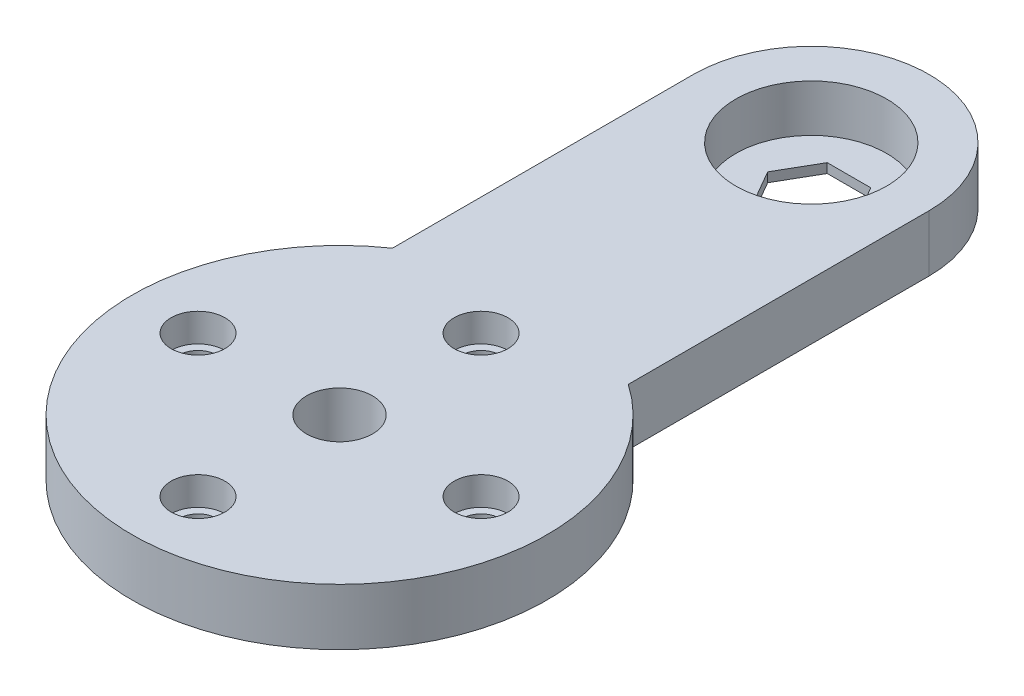
ISO-10303-21;
HEADER;
FILE_DESCRIPTION(('STEP AP214'),'2;1');
FILE_NAME('part.step','',(''),(''),'','','');
FILE_SCHEMA(('AUTOMOTIVE_DESIGN { 1 0 10303 214 1 1 1 1 }'));
ENDSEC;
DATA;
#1=APPLICATION_CONTEXT('core data for automotive mechanical design processes');
#2=APPLICATION_PROTOCOL_DEFINITION('international standard','automotive_design',2000,#1);
#3=PRODUCT_CONTEXT('',#1,'mechanical');
#4=PRODUCT('Part','Part','',(#3));
#5=PRODUCT_RELATED_PRODUCT_CATEGORY('part','',(#4));
#6=PRODUCT_DEFINITION_FORMATION('','',#4);
#7=PRODUCT_DEFINITION_CONTEXT('part definition',#1,'design');
#8=PRODUCT_DEFINITION('design','',#6,#7);
#9=PRODUCT_DEFINITION_SHAPE('','',#8);
#10=(LENGTH_UNIT() NAMED_UNIT(*) SI_UNIT(.MILLI.,.METRE.));
#11=(NAMED_UNIT(*) PLANE_ANGLE_UNIT() SI_UNIT($,.RADIAN.));
#12=(NAMED_UNIT(*) SI_UNIT($,.STERADIAN.) SOLID_ANGLE_UNIT());
#13=UNCERTAINTY_MEASURE_WITH_UNIT(LENGTH_MEASURE(1.E-05),#10,'distance_accuracy_value','');
#14=(GEOMETRIC_REPRESENTATION_CONTEXT(3) GLOBAL_UNCERTAINTY_ASSIGNED_CONTEXT((#13)) GLOBAL_UNIT_ASSIGNED_CONTEXT((#10,
#11,#12)) REPRESENTATION_CONTEXT('',''));
#15=CARTESIAN_POINT('',(0.,0.,0.));
#16=DIRECTION('',(0.,0.,1.));
#17=DIRECTION('',(1.,0.,0.));
#18=AXIS2_PLACEMENT_3D('',#15,#16,#17);
#19=CARTESIAN_POINT('',(0.,6.,50.));
#20=DIRECTION('',(0.,-1.,0.));
#21=DIRECTION('',(0.,0.,-1.));
#22=AXIS2_PLACEMENT_3D('',#19,#20,#21);
#23=CYLINDRICAL_SURFACE('',#22,22.);
#24=CARTESIAN_POINT('',(0.,0.,50.));
#25=DIRECTION('',(0.,1.,0.));
#26=DIRECTION('',(0.,0.,1.));
#27=AXIS2_PLACEMENT_3D('',#24,#25,#26);
#28=CIRCLE('',#27,22.);
#29=CARTESIAN_POINT('',(-12.5,0.,31.8961330097683));
#30=VERTEX_POINT('',#29);
#31=CARTESIAN_POINT('',(12.5,0.,31.8961330097683));
#32=VERTEX_POINT('',#31);
#33=EDGE_CURVE('E176',#30,#32,#28,.T.);
#34=ORIENTED_EDGE('',*,*,#33,.T.);
#35=DIRECTION('',(0.,-1.,0.));
#36=VECTOR('',#35,1.);
#37=CARTESIAN_POINT('',(12.5,6.,31.8961330097683));
#38=LINE('',#37,#36);
#39=CARTESIAN_POINT('',(12.5,6.,31.8961330097683));
#40=VERTEX_POINT('',#39);
#41=EDGE_CURVE('E225',#40,#32,#38,.T.);
#42=ORIENTED_EDGE('',*,*,#41,.F.);
#43=CARTESIAN_POINT('',(0.,6.,50.));
#44=DIRECTION('',(0.,1.,0.));
#45=DIRECTION('',(0.,0.,1.));
#46=AXIS2_PLACEMENT_3D('',#43,#44,#45);
#47=CIRCLE('',#46,22.);
#48=CARTESIAN_POINT('',(-12.5,6.,31.8961330097683));
#49=VERTEX_POINT('',#48);
#50=EDGE_CURVE('E199',#49,#40,#47,.T.);
#51=ORIENTED_EDGE('',*,*,#50,.F.);
#52=DIRECTION('',(0.,-1.,0.));
#53=VECTOR('',#52,1.);
#54=CARTESIAN_POINT('',(-12.5,6.,31.8961330097683));
#55=LINE('',#54,#53);
#56=EDGE_CURVE('E209',#49,#30,#55,.T.);
#57=ORIENTED_EDGE('',*,*,#56,.T.);
#58=EDGE_LOOP('',(#34,#42,#51,#57));
#59=FACE_BOUND('',#58,.T.);
#60=ADVANCED_FACE('F34',(#59),#23,.T.);
#61=CARTESIAN_POINT('',(12.5,6.,0.));
#62=DIRECTION('',(-1.,0.,0.));
#63=DIRECTION('',(0.,0.,1.));
#64=AXIS2_PLACEMENT_3D('',#61,#62,#63);
#65=PLANE('',#64);
#66=DIRECTION('',(0.,0.,-1.));
#67=VECTOR('',#66,1.);
#68=CARTESIAN_POINT('',(12.5,0.,0.));
#69=LINE('',#68,#67);
#70=CARTESIAN_POINT('',(12.5,0.,0.));
#71=VERTEX_POINT('',#70);
#72=EDGE_CURVE('E212',#32,#71,#69,.T.);
#73=ORIENTED_EDGE('',*,*,#72,.T.);
#74=DIRECTION('',(0.,-1.,0.));
#75=VECTOR('',#74,1.);
#76=CARTESIAN_POINT('',(12.5,6.,0.));
#77=LINE('',#76,#75);
#78=CARTESIAN_POINT('',(12.5,6.,0.));
#79=VERTEX_POINT('',#78);
#80=EDGE_CURVE('E222',#79,#71,#77,.T.);
#81=ORIENTED_EDGE('',*,*,#80,.F.);
#82=DIRECTION('',(0.,0.,-1.));
#83=VECTOR('',#82,1.);
#84=CARTESIAN_POINT('',(12.5,6.,0.));
#85=LINE('',#84,#83);
#86=EDGE_CURVE('E202',#40,#79,#85,.T.);
#87=ORIENTED_EDGE('',*,*,#86,.F.);
#88=ORIENTED_EDGE('',*,*,#41,.T.);
#89=EDGE_LOOP('',(#73,#81,#87,#88));
#90=FACE_BOUND('',#89,.T.);
#91=ADVANCED_FACE('F270',(#90),#65,.F.);
#92=CARTESIAN_POINT('',(0.,6.,0.));
#93=DIRECTION('',(0.,-1.,0.));
#94=DIRECTION('',(0.,0.,-1.));
#95=AXIS2_PLACEMENT_3D('',#92,#93,#94);
#96=CYLINDRICAL_SURFACE('',#95,12.5);
#97=CARTESIAN_POINT('',(0.,0.,0.));
#98=DIRECTION('',(0.,1.,0.));
#99=DIRECTION('',(0.,0.,1.));
#100=AXIS2_PLACEMENT_3D('',#97,#98,#99);
#101=CIRCLE('',#100,12.5);
#102=CARTESIAN_POINT('',(-12.5,0.,0.));
#103=VERTEX_POINT('',#102);
#104=EDGE_CURVE('E214',#71,#103,#101,.T.);
#105=ORIENTED_EDGE('',*,*,#104,.T.);
#106=DIRECTION('',(0.,-1.,0.));
#107=VECTOR('',#106,1.);
#108=CARTESIAN_POINT('',(-12.5,6.,0.));
#109=LINE('',#108,#107);
#110=CARTESIAN_POINT('',(-12.5,6.,0.));
#111=VERTEX_POINT('',#110);
#112=EDGE_CURVE('E219',#111,#103,#109,.T.);
#113=ORIENTED_EDGE('',*,*,#112,.F.);
#114=CARTESIAN_POINT('',(0.,6.,0.));
#115=DIRECTION('',(0.,1.,0.));
#116=DIRECTION('',(0.,0.,1.));
#117=AXIS2_PLACEMENT_3D('',#114,#115,#116);
#118=CIRCLE('',#117,12.5);
#119=EDGE_CURVE('E205',#79,#111,#118,.T.);
#120=ORIENTED_EDGE('',*,*,#119,.F.);
#121=ORIENTED_EDGE('',*,*,#80,.T.);
#122=EDGE_LOOP('',(#105,#113,#120,#121));
#123=FACE_BOUND('',#122,.T.);
#124=ADVANCED_FACE('F275',(#123),#96,.T.);
#125=CARTESIAN_POINT('',(-12.5,6.,0.));
#126=DIRECTION('',(1.,0.,0.));
#127=DIRECTION('',(0.,0.,-1.));
#128=AXIS2_PLACEMENT_3D('',#125,#126,#127);
#129=PLANE('',#128);
#130=DIRECTION('',(0.,0.,1.));
#131=VECTOR('',#130,1.);
#132=CARTESIAN_POINT('',(-12.5,0.,0.));
#133=LINE('',#132,#131);
#134=EDGE_CURVE('E203',#103,#30,#133,.T.);
#135=ORIENTED_EDGE('',*,*,#134,.T.);
#136=ORIENTED_EDGE('',*,*,#56,.F.);
#137=DIRECTION('',(0.,0.,1.));
#138=VECTOR('',#137,1.);
#139=CARTESIAN_POINT('',(-12.5,6.,0.));
#140=LINE('',#139,#138);
#141=EDGE_CURVE('E207',#111,#49,#140,.T.);
#142=ORIENTED_EDGE('',*,*,#141,.F.);
#143=ORIENTED_EDGE('',*,*,#112,.T.);
#144=EDGE_LOOP('',(#135,#136,#142,#143));
#145=FACE_BOUND('',#144,.T.);
#146=ADVANCED_FACE('F291',(#145),#129,.F.);
#147=CARTESIAN_POINT('',(0.,6.,50.));
#148=DIRECTION('',(0.,1.,0.));
#149=DIRECTION('',(0.,0.,1.));
#150=AXIS2_PLACEMENT_3D('',#147,#148,#149);
#151=PLANE('',#150);
#152=CARTESIAN_POINT('',(0.,6.,0.));
#153=DIRECTION('',(0.,1.,0.));
#154=DIRECTION('',(0.,0.,1.));
#155=AXIS2_PLACEMENT_3D('',#152,#153,#154);
#156=CIRCLE('',#155,8.);
#157=CARTESIAN_POINT('',(0.,6.,8.));
#158=VERTEX_POINT('',#157);
#159=EDGE_CURVE('E142',#158,#158,#156,.T.);
#160=ORIENTED_EDGE('',*,*,#159,.F.);
#161=EDGE_LOOP('',(#160));
#162=FACE_BOUND('',#161,.T.);
#163=CARTESIAN_POINT('',(0.,6.,49.9999999999998));
#164=DIRECTION('',(0.,1.,0.));
#165=DIRECTION('',(0.,0.,1.));
#166=AXIS2_PLACEMENT_3D('',#163,#164,#165);
#167=CIRCLE('',#166,3.5);
#168=CARTESIAN_POINT('',(0.,6.,53.4999999999998));
#169=VERTEX_POINT('',#168);
#170=EDGE_CURVE('E168',#169,#169,#167,.T.);
#171=ORIENTED_EDGE('',*,*,#170,.F.);
#172=EDGE_LOOP('',(#171));
#173=FACE_BOUND('',#172,.T.);
#174=CARTESIAN_POINT('',(0.,6.,35.));
#175=DIRECTION('',(0.,1.,0.));
#176=DIRECTION('',(0.,0.,1.));
#177=AXIS2_PLACEMENT_3D('',#174,#175,#176);
#178=CIRCLE('',#177,2.85);
#179=CARTESIAN_POINT('',(0.,6.,37.85));
#180=VERTEX_POINT('',#179);
#181=EDGE_CURVE('E177',#180,#180,#178,.T.);
#182=ORIENTED_EDGE('',*,*,#181,.F.);
#183=EDGE_LOOP('',(#182));
#184=FACE_BOUND('',#183,.T.);
#185=CARTESIAN_POINT('',(15.,6.,50.));
#186=DIRECTION('',(0.,1.,0.));
#187=DIRECTION('',(0.,0.,1.));
#188=AXIS2_PLACEMENT_3D('',#185,#186,#187);
#189=CIRCLE('',#188,2.85);
#190=CARTESIAN_POINT('',(15.,6.,52.8500000000001));
#191=VERTEX_POINT('',#190);
#192=EDGE_CURVE('E183',#191,#191,#189,.T.);
#193=ORIENTED_EDGE('',*,*,#192,.F.);
#194=EDGE_LOOP('',(#193));
#195=FACE_BOUND('',#194,.T.);
#196=CARTESIAN_POINT('',(0.,6.,65.));
#197=DIRECTION('',(0.,1.,0.));
#198=DIRECTION('',(0.,0.,1.));
#199=AXIS2_PLACEMENT_3D('',#196,#197,#198);
#200=CIRCLE('',#199,2.85);
#201=CARTESIAN_POINT('',(0.,6.,67.85));
#202=VERTEX_POINT('',#201);
#203=EDGE_CURVE('E189',#202,#202,#200,.T.);
#204=ORIENTED_EDGE('',*,*,#203,.F.);
#205=EDGE_LOOP('',(#204));
#206=FACE_BOUND('',#205,.T.);
#207=CARTESIAN_POINT('',(-15.,6.,49.9999999999998));
#208=DIRECTION('',(0.,1.,0.));
#209=DIRECTION('',(0.,0.,1.));
#210=AXIS2_PLACEMENT_3D('',#207,#208,#209);
#211=CIRCLE('',#210,2.85);
#212=CARTESIAN_POINT('',(-15.,6.,52.8499999999998));
#213=VERTEX_POINT('',#212);
#214=EDGE_CURVE('E195',#213,#213,#211,.T.);
#215=ORIENTED_EDGE('',*,*,#214,.F.);
#216=EDGE_LOOP('',(#215));
#217=FACE_BOUND('',#216,.T.);
#218=ORIENTED_EDGE('',*,*,#50,.T.);
#219=ORIENTED_EDGE('',*,*,#86,.T.);
#220=ORIENTED_EDGE('',*,*,#119,.T.);
#221=ORIENTED_EDGE('',*,*,#141,.T.);
#222=EDGE_LOOP('',(#218,#219,#220,#221));
#223=FACE_BOUND('',#222,.T.);
#224=ADVANCED_FACE('F287',(#162,#173,#184,#195,#206,#217,#223),#151,.T.);
#225=CARTESIAN_POINT('',(0.,0.,50.));
#226=DIRECTION('',(0.,1.,0.));
#227=DIRECTION('',(0.,0.,1.));
#228=AXIS2_PLACEMENT_3D('',#225,#226,#227);
#229=PLANE('',#228);
#230=DIRECTION('',(-0.5,0.,0.866025403784439));
#231=VECTOR('',#230,1.);
#232=CARTESIAN_POINT('',(4.618802153517,0.,0.));
#233=LINE('',#232,#231);
#234=CARTESIAN_POINT('',(4.61880215351701,0.,0.));
#235=VERTEX_POINT('',#234);
#236=CARTESIAN_POINT('',(2.3094010767585,0.,4.));
#237=VERTEX_POINT('',#236);
#238=EDGE_CURVE('E121',#235,#237,#233,.T.);
#239=ORIENTED_EDGE('',*,*,#238,.F.);
#240=DIRECTION('',(0.499999999999999,0.,0.866025403784439));
#241=VECTOR('',#240,1.);
#242=CARTESIAN_POINT('',(2.3094010767585,0.,-4.));
#243=LINE('',#242,#241);
#244=CARTESIAN_POINT('',(2.3094010767585,0.,-4.));
#245=VERTEX_POINT('',#244);
#246=EDGE_CURVE('E48',#245,#235,#243,.T.);
#247=ORIENTED_EDGE('',*,*,#246,.F.);
#248=DIRECTION('',(1.,0.,0.));
#249=VECTOR('',#248,1.);
#250=CARTESIAN_POINT('',(-2.3094010767585,0.,-4.));
#251=LINE('',#250,#249);
#252=CARTESIAN_POINT('',(-2.3094010767585,0.,-4.));
#253=VERTEX_POINT('',#252);
#254=EDGE_CURVE('E137',#253,#245,#251,.T.);
#255=ORIENTED_EDGE('',*,*,#254,.F.);
#256=DIRECTION('',(0.5,0.,-0.866025403784438));
#257=VECTOR('',#256,1.);
#258=CARTESIAN_POINT('',(-4.618802153517,0.,0.));
#259=LINE('',#258,#257);
#260=CARTESIAN_POINT('',(-4.618802153517,0.,0.));
#261=VERTEX_POINT('',#260);
#262=EDGE_CURVE('E131',#261,#253,#259,.T.);
#263=ORIENTED_EDGE('',*,*,#262,.F.);
#264=DIRECTION('',(-0.499999999999999,0.,-0.866025403784439));
#265=VECTOR('',#264,1.);
#266=CARTESIAN_POINT('',(-2.3094010767585,0.,4.));
#267=LINE('',#266,#265);
#268=CARTESIAN_POINT('',(-2.3094010767585,0.,4.));
#269=VERTEX_POINT('',#268);
#270=EDGE_CURVE('E129',#269,#261,#267,.T.);
#271=ORIENTED_EDGE('',*,*,#270,.F.);
#272=DIRECTION('',(-1.,0.,0.));
#273=VECTOR('',#272,1.);
#274=CARTESIAN_POINT('',(2.3094010767585,0.,4.));
#275=LINE('',#274,#273);
#276=EDGE_CURVE('E112',#237,#269,#275,.T.);
#277=ORIENTED_EDGE('',*,*,#276,.F.);
#278=EDGE_LOOP('',(#239,#247,#255,#263,#271,#277));
#279=FACE_BOUND('',#278,.T.);
#280=CARTESIAN_POINT('',(0.,0.,35.));
#281=DIRECTION('',(0.,1.,0.));
#282=DIRECTION('',(0.,0.,1.));
#283=AXIS2_PLACEMENT_3D('',#280,#281,#282);
#284=CIRCLE('',#283,2.);
#285=CARTESIAN_POINT('',(0.,0.,37.));
#286=VERTEX_POINT('',#285);
#287=EDGE_CURVE('E155',#286,#286,#284,.T.);
#288=ORIENTED_EDGE('',*,*,#287,.T.);
#289=EDGE_LOOP('',(#288));
#290=FACE_BOUND('',#289,.T.);
#291=CARTESIAN_POINT('',(-14.9999999999998,0.,49.9999999999999));
#292=DIRECTION('',(0.,1.,0.));
#293=DIRECTION('',(0.,0.,1.));
#294=AXIS2_PLACEMENT_3D('',#291,#292,#293);
#295=CIRCLE('',#294,2.00000000000001);
#296=CARTESIAN_POINT('',(-14.9999999999998,0.,51.9999999999999));
#297=VERTEX_POINT('',#296);
#298=EDGE_CURVE('E152',#297,#297,#295,.T.);
#299=ORIENTED_EDGE('',*,*,#298,.T.);
#300=EDGE_LOOP('',(#299));
#301=FACE_BOUND('',#300,.T.);
#302=CARTESIAN_POINT('',(0.,0.,64.9999999999997));
#303=DIRECTION('',(0.,1.,0.));
#304=DIRECTION('',(0.,0.,1.));
#305=AXIS2_PLACEMENT_3D('',#302,#303,#304);
#306=CIRCLE('',#305,2.);
#307=CARTESIAN_POINT('',(0.,0.,66.9999999999997));
#308=VERTEX_POINT('',#307);
#309=EDGE_CURVE('E160',#308,#308,#306,.T.);
#310=ORIENTED_EDGE('',*,*,#309,.T.);
#311=EDGE_LOOP('',(#310));
#312=FACE_BOUND('',#311,.T.);
#313=CARTESIAN_POINT('',(14.9999999999998,0.,49.9999999999998));
#314=DIRECTION('',(0.,1.,0.));
#315=DIRECTION('',(0.,0.,1.));
#316=AXIS2_PLACEMENT_3D('',#313,#314,#315);
#317=CIRCLE('',#316,2.);
#318=CARTESIAN_POINT('',(14.9999999999998,0.,51.9999999999998));
#319=VERTEX_POINT('',#318);
#320=EDGE_CURVE('E163',#319,#319,#317,.T.);
#321=ORIENTED_EDGE('',*,*,#320,.T.);
#322=EDGE_LOOP('',(#321));
#323=FACE_BOUND('',#322,.T.);
#324=CARTESIAN_POINT('',(0.,0.,49.9999999999998));
#325=DIRECTION('',(0.,1.,0.));
#326=DIRECTION('',(0.,0.,1.));
#327=AXIS2_PLACEMENT_3D('',#324,#325,#326);
#328=CIRCLE('',#327,3.5);
#329=CARTESIAN_POINT('',(0.,0.,53.4999999999998));
#330=VERTEX_POINT('',#329);
#331=EDGE_CURVE('E159',#330,#330,#328,.T.);
#332=ORIENTED_EDGE('',*,*,#331,.T.);
#333=EDGE_LOOP('',(#332));
#334=FACE_BOUND('',#333,.T.);
#335=ORIENTED_EDGE('',*,*,#33,.F.);
#336=ORIENTED_EDGE('',*,*,#134,.F.);
#337=ORIENTED_EDGE('',*,*,#104,.F.);
#338=ORIENTED_EDGE('',*,*,#72,.F.);
#339=EDGE_LOOP('',(#335,#336,#337,#338));
#340=FACE_BOUND('',#339,.T.);
#341=ADVANCED_FACE('F125',(#279,#290,#301,#312,#323,#334,#340),#229,.F.);
#342=CARTESIAN_POINT('',(-15.,3.,49.9999999999998));
#343=DIRECTION('',(0.,1.,0.));
#344=DIRECTION('',(0.,0.,1.));
#345=AXIS2_PLACEMENT_3D('',#342,#343,#344);
#346=CYLINDRICAL_SURFACE('',#345,2.85);
#347=CARTESIAN_POINT('',(-15.,3.,49.9999999999998));
#348=DIRECTION('',(0.,1.,0.));
#349=DIRECTION('',(0.,0.,1.));
#350=AXIS2_PLACEMENT_3D('',#347,#348,#349);
#351=CIRCLE('',#350,2.85);
#352=CARTESIAN_POINT('',(-15.,3.,52.8499999999998));
#353=VERTEX_POINT('',#352);
#354=EDGE_CURVE('E192',#353,#353,#351,.T.);
#355=ORIENTED_EDGE('',*,*,#354,.F.);
#356=EDGE_LOOP('',(#355));
#357=FACE_BOUND('',#356,.T.);
#358=ORIENTED_EDGE('',*,*,#214,.T.);
#359=EDGE_LOOP('',(#358));
#360=FACE_BOUND('',#359,.T.);
#361=ADVANCED_FACE('F302',(#357,#360),#346,.F.);
#362=CARTESIAN_POINT('',(-15.,3.,49.9999999999998));
#363=DIRECTION('',(0.,1.,0.));
#364=DIRECTION('',(0.,0.,1.));
#365=AXIS2_PLACEMENT_3D('',#362,#363,#364);
#366=PLANE('',#365);
#367=CARTESIAN_POINT('',(-14.9999999999998,3.,49.9999999999999));
#368=DIRECTION('',(0.,1.,0.));
#369=DIRECTION('',(0.,0.,1.));
#370=AXIS2_PLACEMENT_3D('',#367,#368,#369);
#371=CIRCLE('',#370,2.00000000000001);
#372=CARTESIAN_POINT('',(-14.9999999999998,3.,51.9999999999999));
#373=VERTEX_POINT('',#372);
#374=EDGE_CURVE('E198',#373,#373,#371,.T.);
#375=ORIENTED_EDGE('',*,*,#374,.F.);
#376=EDGE_LOOP('',(#375));
#377=FACE_BOUND('',#376,.T.);
#378=ORIENTED_EDGE('',*,*,#354,.T.);
#379=EDGE_LOOP('',(#378));
#380=FACE_BOUND('',#379,.T.);
#381=ADVANCED_FACE('F308',(#377,#380),#366,.T.);
#382=CARTESIAN_POINT('',(0.,3.,65.));
#383=DIRECTION('',(0.,1.,0.));
#384=DIRECTION('',(0.,0.,1.));
#385=AXIS2_PLACEMENT_3D('',#382,#383,#384);
#386=CYLINDRICAL_SURFACE('',#385,2.85);
#387=CARTESIAN_POINT('',(0.,3.,65.));
#388=DIRECTION('',(0.,1.,0.));
#389=DIRECTION('',(0.,0.,1.));
#390=AXIS2_PLACEMENT_3D('',#387,#388,#389);
#391=CIRCLE('',#390,2.85);
#392=CARTESIAN_POINT('',(0.,3.,67.85));
#393=VERTEX_POINT('',#392);
#394=EDGE_CURVE('E186',#393,#393,#391,.T.);
#395=ORIENTED_EDGE('',*,*,#394,.F.);
#396=EDGE_LOOP('',(#395));
#397=FACE_BOUND('',#396,.T.);
#398=ORIENTED_EDGE('',*,*,#203,.T.);
#399=EDGE_LOOP('',(#398));
#400=FACE_BOUND('',#399,.T.);
#401=ADVANCED_FACE('F312',(#397,#400),#386,.F.);
#402=CARTESIAN_POINT('',(0.,3.,65.));
#403=DIRECTION('',(0.,1.,0.));
#404=DIRECTION('',(0.,0.,1.));
#405=AXIS2_PLACEMENT_3D('',#402,#403,#404);
#406=PLANE('',#405);
#407=CARTESIAN_POINT('',(0.,3.,64.9999999999997));
#408=DIRECTION('',(0.,1.,0.));
#409=DIRECTION('',(0.,0.,1.));
#410=AXIS2_PLACEMENT_3D('',#407,#408,#409);
#411=CIRCLE('',#410,2.);
#412=CARTESIAN_POINT('',(0.,3.,66.9999999999997));
#413=VERTEX_POINT('',#412);
#414=EDGE_CURVE('E234',#413,#413,#411,.T.);
#415=ORIENTED_EDGE('',*,*,#414,.F.);
#416=EDGE_LOOP('',(#415));
#417=FACE_BOUND('',#416,.T.);
#418=ORIENTED_EDGE('',*,*,#394,.T.);
#419=EDGE_LOOP('',(#418));
#420=FACE_BOUND('',#419,.T.);
#421=ADVANCED_FACE('F316',(#417,#420),#406,.T.);
#422=CARTESIAN_POINT('',(15.,3.,50.));
#423=DIRECTION('',(0.,1.,0.));
#424=DIRECTION('',(0.,0.,1.));
#425=AXIS2_PLACEMENT_3D('',#422,#423,#424);
#426=CYLINDRICAL_SURFACE('',#425,2.85);
#427=CARTESIAN_POINT('',(15.,3.,50.));
#428=DIRECTION('',(0.,1.,0.));
#429=DIRECTION('',(0.,0.,1.));
#430=AXIS2_PLACEMENT_3D('',#427,#428,#429);
#431=CIRCLE('',#430,2.85);
#432=CARTESIAN_POINT('',(15.,3.,52.8500000000001));
#433=VERTEX_POINT('',#432);
#434=EDGE_CURVE('E180',#433,#433,#431,.T.);
#435=ORIENTED_EDGE('',*,*,#434,.F.);
#436=EDGE_LOOP('',(#435));
#437=FACE_BOUND('',#436,.T.);
#438=ORIENTED_EDGE('',*,*,#192,.T.);
#439=EDGE_LOOP('',(#438));
#440=FACE_BOUND('',#439,.T.);
#441=ADVANCED_FACE('F320',(#437,#440),#426,.F.);
#442=CARTESIAN_POINT('',(15.,3.,50.));
#443=DIRECTION('',(0.,1.,0.));
#444=DIRECTION('',(0.,0.,1.));
#445=AXIS2_PLACEMENT_3D('',#442,#443,#444);
#446=PLANE('',#445);
#447=CARTESIAN_POINT('',(14.9999999999998,3.,49.9999999999998));
#448=DIRECTION('',(0.,1.,0.));
#449=DIRECTION('',(0.,0.,1.));
#450=AXIS2_PLACEMENT_3D('',#447,#448,#449);
#451=CIRCLE('',#450,2.);
#452=CARTESIAN_POINT('',(14.9999999999998,3.,51.9999999999998));
#453=VERTEX_POINT('',#452);
#454=EDGE_CURVE('E231',#453,#453,#451,.T.);
#455=ORIENTED_EDGE('',*,*,#454,.F.);
#456=EDGE_LOOP('',(#455));
#457=FACE_BOUND('',#456,.T.);
#458=ORIENTED_EDGE('',*,*,#434,.T.);
#459=EDGE_LOOP('',(#458));
#460=FACE_BOUND('',#459,.T.);
#461=ADVANCED_FACE('F324',(#457,#460),#446,.T.);
#462=CARTESIAN_POINT('',(0.,3.,35.));
#463=DIRECTION('',(0.,1.,0.));
#464=DIRECTION('',(0.,0.,1.));
#465=AXIS2_PLACEMENT_3D('',#462,#463,#464);
#466=CYLINDRICAL_SURFACE('',#465,2.85);
#467=CARTESIAN_POINT('',(0.,3.,35.));
#468=DIRECTION('',(0.,1.,0.));
#469=DIRECTION('',(0.,0.,1.));
#470=AXIS2_PLACEMENT_3D('',#467,#468,#469);
#471=CIRCLE('',#470,2.85);
#472=CARTESIAN_POINT('',(0.,3.,37.85));
#473=VERTEX_POINT('',#472);
#474=EDGE_CURVE('E173',#473,#473,#471,.T.);
#475=ORIENTED_EDGE('',*,*,#474,.F.);
#476=EDGE_LOOP('',(#475));
#477=FACE_BOUND('',#476,.T.);
#478=ORIENTED_EDGE('',*,*,#181,.T.);
#479=EDGE_LOOP('',(#478));
#480=FACE_BOUND('',#479,.T.);
#481=ADVANCED_FACE('F328',(#477,#480),#466,.F.);
#482=CARTESIAN_POINT('',(0.,3.,35.));
#483=DIRECTION('',(0.,1.,0.));
#484=DIRECTION('',(0.,0.,1.));
#485=AXIS2_PLACEMENT_3D('',#482,#483,#484);
#486=PLANE('',#485);
#487=CARTESIAN_POINT('',(0.,3.,35.));
#488=DIRECTION('',(0.,1.,0.));
#489=DIRECTION('',(0.,0.,1.));
#490=AXIS2_PLACEMENT_3D('',#487,#488,#489);
#491=CIRCLE('',#490,2.);
#492=CARTESIAN_POINT('',(0.,3.,37.));
#493=VERTEX_POINT('',#492);
#494=EDGE_CURVE('E158',#493,#493,#491,.T.);
#495=ORIENTED_EDGE('',*,*,#494,.F.);
#496=EDGE_LOOP('',(#495));
#497=FACE_BOUND('',#496,.T.);
#498=ORIENTED_EDGE('',*,*,#474,.T.);
#499=EDGE_LOOP('',(#498));
#500=FACE_BOUND('',#499,.T.);
#501=ADVANCED_FACE('F332',(#497,#500),#486,.T.);
#502=CARTESIAN_POINT('',(0.,0.,35.));
#503=DIRECTION('',(0.,1.,0.));
#504=DIRECTION('',(0.,0.,1.));
#505=AXIS2_PLACEMENT_3D('',#502,#503,#504);
#506=CYLINDRICAL_SURFACE('',#505,2.);
#507=ORIENTED_EDGE('',*,*,#494,.T.);
#508=EDGE_LOOP('',(#507));
#509=FACE_BOUND('',#508,.T.);
#510=ORIENTED_EDGE('',*,*,#287,.F.);
#511=EDGE_LOOP('',(#510));
#512=FACE_BOUND('',#511,.T.);
#513=ADVANCED_FACE('F336',(#509,#512),#506,.F.);
#514=CARTESIAN_POINT('',(14.9999999999998,0.,49.9999999999998));
#515=DIRECTION('',(0.,1.,0.));
#516=DIRECTION('',(0.,0.,1.));
#517=AXIS2_PLACEMENT_3D('',#514,#515,#516);
#518=CYLINDRICAL_SURFACE('',#517,2.);
#519=ORIENTED_EDGE('',*,*,#454,.T.);
#520=EDGE_LOOP('',(#519));
#521=FACE_BOUND('',#520,.T.);
#522=ORIENTED_EDGE('',*,*,#320,.F.);
#523=EDGE_LOOP('',(#522));
#524=FACE_BOUND('',#523,.T.);
#525=ADVANCED_FACE('F338',(#521,#524),#518,.F.);
#526=CARTESIAN_POINT('',(0.,0.,64.9999999999997));
#527=DIRECTION('',(0.,1.,0.));
#528=DIRECTION('',(0.,0.,1.));
#529=AXIS2_PLACEMENT_3D('',#526,#527,#528);
#530=CYLINDRICAL_SURFACE('',#529,2.);
#531=ORIENTED_EDGE('',*,*,#414,.T.);
#532=EDGE_LOOP('',(#531));
#533=FACE_BOUND('',#532,.T.);
#534=ORIENTED_EDGE('',*,*,#309,.F.);
#535=EDGE_LOOP('',(#534));
#536=FACE_BOUND('',#535,.T.);
#537=ADVANCED_FACE('F341',(#533,#536),#530,.F.);
#538=CARTESIAN_POINT('',(-14.9999999999998,0.,49.9999999999999));
#539=DIRECTION('',(0.,1.,0.));
#540=DIRECTION('',(0.,0.,1.));
#541=AXIS2_PLACEMENT_3D('',#538,#539,#540);
#542=CYLINDRICAL_SURFACE('',#541,2.00000000000001);
#543=ORIENTED_EDGE('',*,*,#374,.T.);
#544=EDGE_LOOP('',(#543));
#545=FACE_BOUND('',#544,.T.);
#546=ORIENTED_EDGE('',*,*,#298,.F.);
#547=EDGE_LOOP('',(#546));
#548=FACE_BOUND('',#547,.T.);
#549=ADVANCED_FACE('F347',(#545,#548),#542,.F.);
#550=CARTESIAN_POINT('',(0.,0.,49.9999999999998));
#551=DIRECTION('',(0.,1.,0.));
#552=DIRECTION('',(0.,0.,1.));
#553=AXIS2_PLACEMENT_3D('',#550,#551,#552);
#554=CYLINDRICAL_SURFACE('',#553,3.5);
#555=ORIENTED_EDGE('',*,*,#331,.F.);
#556=EDGE_LOOP('',(#555));
#557=FACE_BOUND('',#556,.T.);
#558=ORIENTED_EDGE('',*,*,#170,.T.);
#559=EDGE_LOOP('',(#558));
#560=FACE_BOUND('',#559,.T.);
#561=ADVANCED_FACE('F343',(#557,#560),#554,.F.);
#562=CARTESIAN_POINT('',(0.,1.,0.));
#563=DIRECTION('',(0.,1.,0.));
#564=DIRECTION('',(0.,0.,1.));
#565=AXIS2_PLACEMENT_3D('',#562,#563,#564);
#566=CYLINDRICAL_SURFACE('',#565,8.);
#567=CARTESIAN_POINT('',(0.,1.,0.));
#568=DIRECTION('',(0.,1.,0.));
#569=DIRECTION('',(0.,0.,1.));
#570=AXIS2_PLACEMENT_3D('',#567,#568,#569);
#571=CIRCLE('',#570,8.);
#572=CARTESIAN_POINT('',(0.,1.,8.));
#573=VERTEX_POINT('',#572);
#574=EDGE_CURVE('E149',#573,#573,#571,.T.);
#575=ORIENTED_EDGE('',*,*,#574,.F.);
#576=EDGE_LOOP('',(#575));
#577=FACE_BOUND('',#576,.T.);
#578=ORIENTED_EDGE('',*,*,#159,.T.);
#579=EDGE_LOOP('',(#578));
#580=FACE_BOUND('',#579,.T.);
#581=ADVANCED_FACE('F346',(#577,#580),#566,.F.);
#582=CARTESIAN_POINT('',(0.,1.,0.));
#583=DIRECTION('',(0.,1.,0.));
#584=DIRECTION('',(0.,0.,1.));
#585=AXIS2_PLACEMENT_3D('',#582,#583,#584);
#586=PLANE('',#585);
#587=DIRECTION('',(-0.499999999999999,0.,-0.866025403784439));
#588=VECTOR('',#587,1.);
#589=CARTESIAN_POINT('',(3.46410161513775,1.,-2.));
#590=LINE('',#589,#588);
#591=CARTESIAN_POINT('',(4.618802153517,1.,0.));
#592=VERTEX_POINT('',#591);
#593=CARTESIAN_POINT('',(2.3094010767585,1.,-4.));
#594=VERTEX_POINT('',#593);
#595=EDGE_CURVE('E11',#592,#594,#590,.T.);
#596=ORIENTED_EDGE('',*,*,#595,.F.);
#597=DIRECTION('',(0.5,0.,-0.866025403784439));
#598=VECTOR('',#597,1.);
#599=CARTESIAN_POINT('',(3.46410161513775,1.,2.));
#600=LINE('',#599,#598);
#601=CARTESIAN_POINT('',(2.3094010767585,1.,4.));
#602=VERTEX_POINT('',#601);
#603=EDGE_CURVE('E228',#602,#592,#600,.T.);
#604=ORIENTED_EDGE('',*,*,#603,.F.);
#605=DIRECTION('',(1.,0.,0.));
#606=VECTOR('',#605,1.);
#607=CARTESIAN_POINT('',(0.,1.,4.));
#608=LINE('',#607,#606);
#609=CARTESIAN_POINT('',(-2.3094010767585,1.,4.));
#610=VERTEX_POINT('',#609);
#611=EDGE_CURVE('E115',#610,#602,#608,.T.);
#612=ORIENTED_EDGE('',*,*,#611,.F.);
#613=DIRECTION('',(0.499999999999999,0.,0.866025403784439));
#614=VECTOR('',#613,1.);
#615=CARTESIAN_POINT('',(-3.46410161513775,1.,2.));
#616=LINE('',#615,#614);
#617=CARTESIAN_POINT('',(-4.618802153517,1.,0.));
#618=VERTEX_POINT('',#617);
#619=EDGE_CURVE('E241',#618,#610,#616,.T.);
#620=ORIENTED_EDGE('',*,*,#619,.F.);
#621=DIRECTION('',(-0.500000000000001,0.,0.866025403784438));
#622=VECTOR('',#621,1.);
#623=CARTESIAN_POINT('',(-3.46410161513775,1.,-2.));
#624=LINE('',#623,#622);
#625=CARTESIAN_POINT('',(-2.3094010767585,1.,-4.));
#626=VERTEX_POINT('',#625);
#627=EDGE_CURVE('E243',#626,#618,#624,.T.);
#628=ORIENTED_EDGE('',*,*,#627,.F.);
#629=DIRECTION('',(-1.,0.,0.));
#630=VECTOR('',#629,1.);
#631=CARTESIAN_POINT('',(0.,1.,-4.));
#632=LINE('',#631,#630);
#633=EDGE_CURVE('E41',#594,#626,#632,.T.);
#634=ORIENTED_EDGE('',*,*,#633,.F.);
#635=EDGE_LOOP('',(#596,#604,#612,#620,#628,#634));
#636=FACE_BOUND('',#635,.T.);
#637=ORIENTED_EDGE('',*,*,#574,.T.);
#638=EDGE_LOOP('',(#637));
#639=FACE_BOUND('',#638,.T.);
#640=ADVANCED_FACE('F257',(#636,#639),#586,.T.);
#641=CARTESIAN_POINT('',(2.3094010767585,3.,-4.));
#642=DIRECTION('',(0.866025403784439,0.,-0.499999999999999));
#643=DIRECTION('',(-0.499999999999999,0.,-0.866025403784439));
#644=AXIS2_PLACEMENT_3D('',#641,#642,#643);
#645=PLANE('',#644);
#646=ORIENTED_EDGE('',*,*,#595,.T.);
#647=DIRECTION('',(0.,-1.,0.));
#648=VECTOR('',#647,1.);
#649=CARTESIAN_POINT('',(2.3094010767585,3.,-4.));
#650=LINE('',#649,#648);
#651=EDGE_CURVE('E140',#594,#245,#650,.T.);
#652=ORIENTED_EDGE('',*,*,#651,.T.);
#653=ORIENTED_EDGE('',*,*,#246,.T.);
#654=DIRECTION('',(0.,-1.,0.));
#655=VECTOR('',#654,1.);
#656=CARTESIAN_POINT('',(4.618802153517,3.,0.));
#657=LINE('',#656,#655);
#658=EDGE_CURVE('E118',#592,#235,#657,.T.);
#659=ORIENTED_EDGE('',*,*,#658,.F.);
#660=EDGE_LOOP('',(#646,#652,#653,#659));
#661=FACE_BOUND('',#660,.T.);
#662=ADVANCED_FACE('F363',(#661),#645,.F.);
#663=CARTESIAN_POINT('',(-2.3094010767585,3.,-4.));
#664=DIRECTION('',(0.,0.,-1.));
#665=DIRECTION('',(-1.,0.,0.));
#666=AXIS2_PLACEMENT_3D('',#663,#664,#665);
#667=PLANE('',#666);
#668=ORIENTED_EDGE('',*,*,#633,.T.);
#669=DIRECTION('',(0.,-1.,0.));
#670=VECTOR('',#669,1.);
#671=CARTESIAN_POINT('',(-2.3094010767585,3.,-4.));
#672=LINE('',#671,#670);
#673=EDGE_CURVE('E143',#626,#253,#672,.T.);
#674=ORIENTED_EDGE('',*,*,#673,.T.);
#675=ORIENTED_EDGE('',*,*,#254,.T.);
#676=ORIENTED_EDGE('',*,*,#651,.F.);
#677=EDGE_LOOP('',(#668,#674,#675,#676));
#678=FACE_BOUND('',#677,.T.);
#679=ADVANCED_FACE('F248',(#678),#667,.F.);
#680=CARTESIAN_POINT('',(-4.618802153517,3.,0.));
#681=DIRECTION('',(-0.866025403784438,0.,-0.500000000000001));
#682=DIRECTION('',(-0.500000000000001,0.,0.866025403784438));
#683=AXIS2_PLACEMENT_3D('',#680,#681,#682);
#684=PLANE('',#683);
#685=ORIENTED_EDGE('',*,*,#627,.T.);
#686=DIRECTION('',(0.,-1.,0.));
#687=VECTOR('',#686,1.);
#688=CARTESIAN_POINT('',(-4.618802153517,3.,0.));
#689=LINE('',#688,#687);
#690=EDGE_CURVE('E145',#618,#261,#689,.T.);
#691=ORIENTED_EDGE('',*,*,#690,.T.);
#692=ORIENTED_EDGE('',*,*,#262,.T.);
#693=ORIENTED_EDGE('',*,*,#673,.F.);
#694=EDGE_LOOP('',(#685,#691,#692,#693));
#695=FACE_BOUND('',#694,.T.);
#696=ADVANCED_FACE('F253',(#695),#684,.F.);
#697=CARTESIAN_POINT('',(-2.3094010767585,3.,4.));
#698=DIRECTION('',(-0.866025403784439,0.,0.499999999999999));
#699=DIRECTION('',(0.499999999999999,0.,0.866025403784439));
#700=AXIS2_PLACEMENT_3D('',#697,#698,#699);
#701=PLANE('',#700);
#702=ORIENTED_EDGE('',*,*,#619,.T.);
#703=DIRECTION('',(0.,-1.,0.));
#704=VECTOR('',#703,1.);
#705=CARTESIAN_POINT('',(-2.3094010767585,3.,4.));
#706=LINE('',#705,#704);
#707=EDGE_CURVE('E117',#610,#269,#706,.T.);
#708=ORIENTED_EDGE('',*,*,#707,.T.);
#709=ORIENTED_EDGE('',*,*,#270,.T.);
#710=ORIENTED_EDGE('',*,*,#690,.F.);
#711=EDGE_LOOP('',(#702,#708,#709,#710));
#712=FACE_BOUND('',#711,.T.);
#713=ADVANCED_FACE('F260',(#712),#701,.F.);
#714=CARTESIAN_POINT('',(2.3094010767585,3.,4.));
#715=DIRECTION('',(0.,0.,1.));
#716=DIRECTION('',(1.,0.,0.));
#717=AXIS2_PLACEMENT_3D('',#714,#715,#716);
#718=PLANE('',#717);
#719=ORIENTED_EDGE('',*,*,#611,.T.);
#720=DIRECTION('',(0.,-1.,0.));
#721=VECTOR('',#720,1.);
#722=CARTESIAN_POINT('',(2.3094010767585,3.,4.));
#723=LINE('',#722,#721);
#724=EDGE_CURVE('E56',#602,#237,#723,.T.);
#725=ORIENTED_EDGE('',*,*,#724,.T.);
#726=ORIENTED_EDGE('',*,*,#276,.T.);
#727=ORIENTED_EDGE('',*,*,#707,.F.);
#728=EDGE_LOOP('',(#719,#725,#726,#727));
#729=FACE_BOUND('',#728,.T.);
#730=ADVANCED_FACE('F109',(#729),#718,.F.);
#731=CARTESIAN_POINT('',(4.618802153517,3.,0.));
#732=DIRECTION('',(0.866025403784438,0.,0.5));
#733=DIRECTION('',(0.5,0.,-0.866025403784439));
#734=AXIS2_PLACEMENT_3D('',#731,#732,#733);
#735=PLANE('',#734);
#736=ORIENTED_EDGE('',*,*,#603,.T.);
#737=ORIENTED_EDGE('',*,*,#658,.T.);
#738=ORIENTED_EDGE('',*,*,#238,.T.);
#739=ORIENTED_EDGE('',*,*,#724,.F.);
#740=EDGE_LOOP('',(#736,#737,#738,#739));
#741=FACE_BOUND('',#740,.T.);
#742=ADVANCED_FACE('F122',(#741),#735,.F.);
#743=CLOSED_SHELL('',(#60,#91,#124,#146,#224,#341,#361,#381,#401,#421,#441,#461,#481,#501,#513,
#525,#537,#549,#561,#581,#640,#662,#679,#696,#713,#730,#742));
#744=MANIFOLD_SOLID_BREP('B2',#743);
#745=ADVANCED_BREP_SHAPE_REPRESENTATION('',(#18,#744),#14);
#746=SHAPE_DEFINITION_REPRESENTATION(#9,#745);
ENDSEC;
END-ISO-10303-21;
